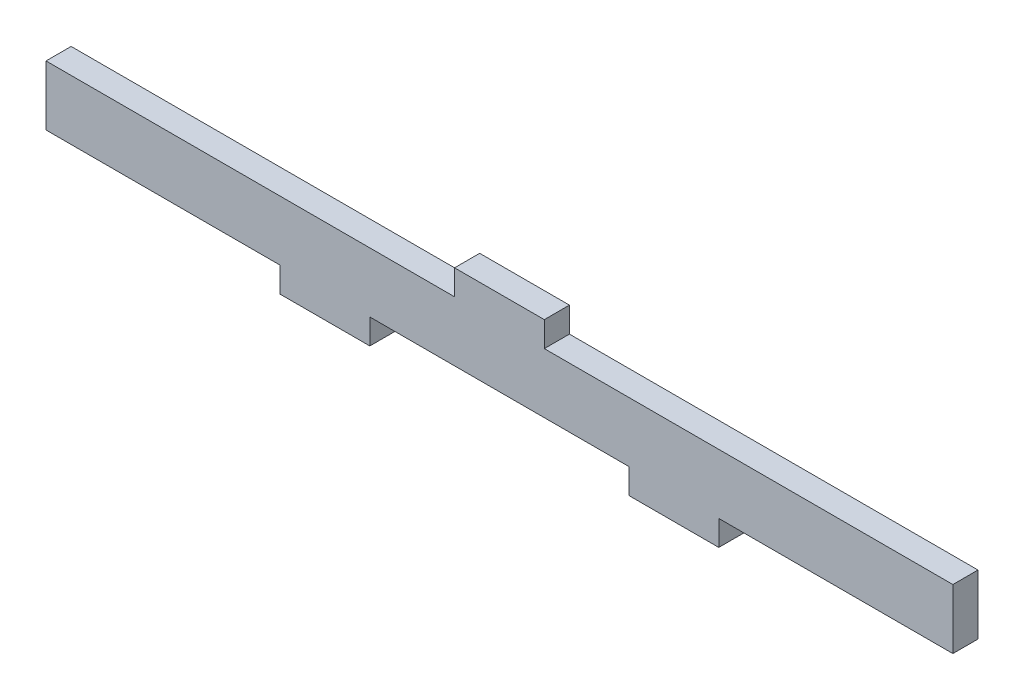
ISO-10303-21;
HEADER;
FILE_DESCRIPTION(('STEP AP214'),'2;1');
FILE_NAME('part.step','',(''),(''),'','','');
FILE_SCHEMA(('AUTOMOTIVE_DESIGN { 1 0 10303 214 1 1 1 1 }'));
ENDSEC;
DATA;
#1=APPLICATION_CONTEXT('core data for automotive mechanical design processes');
#2=APPLICATION_PROTOCOL_DEFINITION('international standard','automotive_design',2000,#1);
#3=PRODUCT_CONTEXT('',#1,'mechanical');
#4=PRODUCT('Part','Part','',(#3));
#5=PRODUCT_RELATED_PRODUCT_CATEGORY('part','',(#4));
#6=PRODUCT_DEFINITION_FORMATION('','',#4);
#7=PRODUCT_DEFINITION_CONTEXT('part definition',#1,'design');
#8=PRODUCT_DEFINITION('design','',#6,#7);
#9=PRODUCT_DEFINITION_SHAPE('','',#8);
#10=(LENGTH_UNIT() NAMED_UNIT(*) SI_UNIT(.MILLI.,.METRE.));
#11=(NAMED_UNIT(*) PLANE_ANGLE_UNIT() SI_UNIT($,.RADIAN.));
#12=(NAMED_UNIT(*) SI_UNIT($,.STERADIAN.) SOLID_ANGLE_UNIT());
#13=UNCERTAINTY_MEASURE_WITH_UNIT(LENGTH_MEASURE(1.E-05),#10,'distance_accuracy_value','');
#14=(GEOMETRIC_REPRESENTATION_CONTEXT(3) GLOBAL_UNCERTAINTY_ASSIGNED_CONTEXT((#13)) GLOBAL_UNIT_ASSIGNED_CONTEXT((#10,
#11,#12)) REPRESENTATION_CONTEXT('',''));
#15=CARTESIAN_POINT('',(0.,0.,0.));
#16=DIRECTION('',(0.,0.,1.));
#17=DIRECTION('',(1.,0.,0.));
#18=AXIS2_PLACEMENT_3D('',#15,#16,#17);
#19=CARTESIAN_POINT('',(0.,0.,5.334));
#20=DIRECTION('',(0.,1.,0.));
#21=DIRECTION('',(0.,0.,1.));
#22=AXIS2_PLACEMENT_3D('',#19,#20,#21);
#23=PLANE('',#22);
#24=DIRECTION('',(1.,0.,0.));
#25=VECTOR('',#24,1.);
#26=CARTESIAN_POINT('',(0.,0.,0.));
#27=LINE('',#26,#25);
#28=CARTESIAN_POINT('',(49.6993333333333,0.,0.));
#29=VERTEX_POINT('',#28);
#30=CARTESIAN_POINT('',(68.7493333333334,0.,0.));
#31=VERTEX_POINT('',#30);
#32=EDGE_CURVE('E169',#29,#31,#27,.T.);
#33=ORIENTED_EDGE('',*,*,#32,.T.);
#34=DIRECTION('',(0.,0.,1.));
#35=VECTOR('',#34,1.);
#36=CARTESIAN_POINT('',(68.7493333333334,0.,0.));
#37=LINE('',#36,#35);
#38=CARTESIAN_POINT('',(68.7493333333334,0.,5.334));
#39=VERTEX_POINT('',#38);
#40=EDGE_CURVE('E205',#31,#39,#37,.T.);
#41=ORIENTED_EDGE('',*,*,#40,.T.);
#42=DIRECTION('',(1.,0.,0.));
#43=VECTOR('',#42,1.);
#44=CARTESIAN_POINT('',(0.,0.,5.334));
#45=LINE('',#44,#43);
#46=CARTESIAN_POINT('',(49.6993333333333,0.,5.334));
#47=VERTEX_POINT('',#46);
#48=EDGE_CURVE('E183',#47,#39,#45,.T.);
#49=ORIENTED_EDGE('',*,*,#48,.F.);
#50=DIRECTION('',(0.,0.,1.));
#51=VECTOR('',#50,1.);
#52=CARTESIAN_POINT('',(49.6993333333333,0.,0.));
#53=LINE('',#52,#51);
#54=EDGE_CURVE('E186',#29,#47,#53,.T.);
#55=ORIENTED_EDGE('',*,*,#54,.F.);
#56=EDGE_LOOP('',(#33,#41,#49,#55));
#57=FACE_BOUND('',#56,.T.);
#58=ADVANCED_FACE('F32',(#57),#23,.F.);
#59=CARTESIAN_POINT('',(0.,0.,5.334));
#60=DIRECTION('',(1.,0.,0.));
#61=DIRECTION('',(0.,1.,0.));
#62=AXIS2_PLACEMENT_3D('',#59,#60,#61);
#63=PLANE('',#62);
#64=DIRECTION('',(0.,-1.,0.));
#65=VECTOR('',#64,1.);
#66=CARTESIAN_POINT('',(0.,0.,5.334));
#67=LINE('',#66,#65);
#68=CARTESIAN_POINT('',(0.,18.034,5.334));
#69=VERTEX_POINT('',#68);
#70=CARTESIAN_POINT('',(0.,5.334,5.334));
#71=VERTEX_POINT('',#70);
#72=EDGE_CURVE('E164',#69,#71,#67,.T.);
#73=ORIENTED_EDGE('',*,*,#72,.F.);
#74=DIRECTION('',(0.,0.,1.));
#75=VECTOR('',#74,1.);
#76=CARTESIAN_POINT('',(0.,18.034,0.));
#77=LINE('',#76,#75);
#78=CARTESIAN_POINT('',(0.,18.034,0.));
#79=VERTEX_POINT('',#78);
#80=EDGE_CURVE('E249',#79,#69,#77,.T.);
#81=ORIENTED_EDGE('',*,*,#80,.F.);
#82=DIRECTION('',(0.,-1.,0.));
#83=VECTOR('',#82,1.);
#84=CARTESIAN_POINT('',(0.,0.,0.));
#85=LINE('',#84,#83);
#86=CARTESIAN_POINT('',(0.,5.334,0.));
#87=VERTEX_POINT('',#86);
#88=EDGE_CURVE('E178',#79,#87,#85,.T.);
#89=ORIENTED_EDGE('',*,*,#88,.T.);
#90=DIRECTION('',(0.,0.,1.));
#91=VECTOR('',#90,1.);
#92=CARTESIAN_POINT('',(0.,5.334,0.));
#93=LINE('',#92,#91);
#94=EDGE_CURVE('E179',#87,#71,#93,.T.);
#95=ORIENTED_EDGE('',*,*,#94,.T.);
#96=EDGE_LOOP('',(#73,#81,#89,#95));
#97=FACE_BOUND('',#96,.T.);
#98=ADVANCED_FACE('F34',(#97),#63,.F.);
#99=CARTESIAN_POINT('',(123.782666666667,0.,0.));
#100=VERTEX_POINT('',#99);
#101=CARTESIAN_POINT('',(142.832666666667,0.,0.));
#102=VERTEX_POINT('',#101);
#103=EDGE_CURVE('E175',#100,#102,#27,.T.);
#104=ORIENTED_EDGE('',*,*,#103,.T.);
#105=DIRECTION('',(0.,0.,1.));
#106=VECTOR('',#105,1.);
#107=CARTESIAN_POINT('',(142.832666666667,0.,0.));
#108=LINE('',#107,#106);
#109=CARTESIAN_POINT('',(142.832666666667,0.,5.334));
#110=VERTEX_POINT('',#109);
#111=EDGE_CURVE('E223',#102,#110,#108,.T.);
#112=ORIENTED_EDGE('',*,*,#111,.T.);
#113=CARTESIAN_POINT('',(123.782666666667,0.,5.334));
#114=VERTEX_POINT('',#113);
#115=EDGE_CURVE('E166',#114,#110,#45,.T.);
#116=ORIENTED_EDGE('',*,*,#115,.F.);
#117=DIRECTION('',(0.,0.,1.));
#118=VECTOR('',#117,1.);
#119=CARTESIAN_POINT('',(123.782666666667,0.,0.));
#120=LINE('',#119,#118);
#121=EDGE_CURVE('E208',#100,#114,#120,.T.);
#122=ORIENTED_EDGE('',*,*,#121,.F.);
#123=EDGE_LOOP('',(#104,#112,#116,#122));
#124=FACE_BOUND('',#123,.T.);
#125=ADVANCED_FACE('F287',(#124),#23,.F.);
#126=CARTESIAN_POINT('',(192.532,0.,5.334));
#127=DIRECTION('',(-1.,0.,0.));
#128=DIRECTION('',(0.,-1.,0.));
#129=AXIS2_PLACEMENT_3D('',#126,#127,#128);
#130=PLANE('',#129);
#131=DIRECTION('',(0.,1.,0.));
#132=VECTOR('',#131,1.);
#133=CARTESIAN_POINT('',(192.532,0.,0.));
#134=LINE('',#133,#132);
#135=CARTESIAN_POINT('',(192.532,5.334,0.));
#136=VERTEX_POINT('',#135);
#137=CARTESIAN_POINT('',(192.532,18.034,0.));
#138=VERTEX_POINT('',#137);
#139=EDGE_CURVE('E165',#136,#138,#134,.T.);
#140=ORIENTED_EDGE('',*,*,#139,.T.);
#141=DIRECTION('',(0.,0.,1.));
#142=VECTOR('',#141,1.);
#143=CARTESIAN_POINT('',(192.532,18.034,0.));
#144=LINE('',#143,#142);
#145=CARTESIAN_POINT('',(192.532,18.034,5.334));
#146=VERTEX_POINT('',#145);
#147=EDGE_CURVE('E261',#138,#146,#144,.T.);
#148=ORIENTED_EDGE('',*,*,#147,.T.);
#149=DIRECTION('',(0.,1.,0.));
#150=VECTOR('',#149,1.);
#151=CARTESIAN_POINT('',(192.532,0.,5.334));
#152=LINE('',#151,#150);
#153=CARTESIAN_POINT('',(192.532,5.334,5.334));
#154=VERTEX_POINT('',#153);
#155=EDGE_CURVE('E41',#154,#146,#152,.T.);
#156=ORIENTED_EDGE('',*,*,#155,.F.);
#157=DIRECTION('',(0.,0.,1.));
#158=VECTOR('',#157,1.);
#159=CARTESIAN_POINT('',(192.532,5.334,0.));
#160=LINE('',#159,#158);
#161=EDGE_CURVE('E231',#136,#154,#160,.T.);
#162=ORIENTED_EDGE('',*,*,#161,.F.);
#163=EDGE_LOOP('',(#140,#148,#156,#162));
#164=FACE_BOUND('',#163,.T.);
#165=ADVANCED_FACE('F276',(#164),#130,.F.);
#166=CARTESIAN_POINT('',(0.,23.368,5.334));
#167=DIRECTION('',(0.,-1.,0.));
#168=DIRECTION('',(0.,0.,-1.));
#169=AXIS2_PLACEMENT_3D('',#166,#167,#168);
#170=PLANE('',#169);
#171=DIRECTION('',(-1.,0.,0.));
#172=VECTOR('',#171,1.);
#173=CARTESIAN_POINT('',(0.,23.368,5.334));
#174=LINE('',#173,#172);
#175=CARTESIAN_POINT('',(105.791,23.368,5.334));
#176=VERTEX_POINT('',#175);
#177=CARTESIAN_POINT('',(86.741,23.368,5.334));
#178=VERTEX_POINT('',#177);
#179=EDGE_CURVE('E11',#176,#178,#174,.T.);
#180=ORIENTED_EDGE('',*,*,#179,.F.);
#181=DIRECTION('',(0.,0.,1.));
#182=VECTOR('',#181,1.);
#183=CARTESIAN_POINT('',(105.791,23.368,0.));
#184=LINE('',#183,#182);
#185=CARTESIAN_POINT('',(105.791,23.368,0.));
#186=VERTEX_POINT('',#185);
#187=EDGE_CURVE('E150',#186,#176,#184,.T.);
#188=ORIENTED_EDGE('',*,*,#187,.F.);
#189=DIRECTION('',(-1.,0.,0.));
#190=VECTOR('',#189,1.);
#191=CARTESIAN_POINT('',(0.,23.368,0.));
#192=LINE('',#191,#190);
#193=CARTESIAN_POINT('',(86.741,23.368,0.));
#194=VERTEX_POINT('',#193);
#195=EDGE_CURVE('E36',#186,#194,#192,.T.);
#196=ORIENTED_EDGE('',*,*,#195,.T.);
#197=DIRECTION('',(0.,0.,1.));
#198=VECTOR('',#197,1.);
#199=CARTESIAN_POINT('',(86.741,23.368,0.));
#200=LINE('',#199,#198);
#201=EDGE_CURVE('E244',#194,#178,#200,.T.);
#202=ORIENTED_EDGE('',*,*,#201,.T.);
#203=EDGE_LOOP('',(#180,#188,#196,#202));
#204=FACE_BOUND('',#203,.T.);
#205=ADVANCED_FACE('F159',(#204),#170,.F.);
#206=CARTESIAN_POINT('',(0.,0.,5.334));
#207=DIRECTION('',(0.,0.,-1.));
#208=DIRECTION('',(-1.,0.,0.));
#209=AXIS2_PLACEMENT_3D('',#206,#207,#208);
#210=PLANE('',#209);
#211=ORIENTED_EDGE('',*,*,#155,.T.);
#212=DIRECTION('',(1.,0.,0.));
#213=VECTOR('',#212,1.);
#214=CARTESIAN_POINT('',(192.532,18.034,5.334));
#215=LINE('',#214,#213);
#216=CARTESIAN_POINT('',(105.791,18.034,5.334));
#217=VERTEX_POINT('',#216);
#218=EDGE_CURVE('E155',#217,#146,#215,.T.);
#219=ORIENTED_EDGE('',*,*,#218,.F.);
#220=DIRECTION('',(0.,-1.,0.));
#221=VECTOR('',#220,1.);
#222=CARTESIAN_POINT('',(105.791,23.368,5.334));
#223=LINE('',#222,#221);
#224=EDGE_CURVE('E267',#176,#217,#223,.T.);
#225=ORIENTED_EDGE('',*,*,#224,.F.);
#226=ORIENTED_EDGE('',*,*,#179,.T.);
#227=DIRECTION('',(0.,1.,0.));
#228=VECTOR('',#227,1.);
#229=CARTESIAN_POINT('',(86.741,23.368,5.334));
#230=LINE('',#229,#228);
#231=CARTESIAN_POINT('',(86.741,18.034,5.334));
#232=VERTEX_POINT('',#231);
#233=EDGE_CURVE('E254',#232,#178,#230,.T.);
#234=ORIENTED_EDGE('',*,*,#233,.F.);
#235=DIRECTION('',(1.,0.,0.));
#236=VECTOR('',#235,1.);
#237=CARTESIAN_POINT('',(0.,18.034,5.334));
#238=LINE('',#237,#236);
#239=EDGE_CURVE('E258',#69,#232,#238,.T.);
#240=ORIENTED_EDGE('',*,*,#239,.F.);
#241=ORIENTED_EDGE('',*,*,#72,.T.);
#242=DIRECTION('',(-1.,0.,0.));
#243=VECTOR('',#242,1.);
#244=CARTESIAN_POINT('',(0.,5.334,5.334));
#245=LINE('',#244,#243);
#246=CARTESIAN_POINT('',(49.6993333333333,5.334,5.334));
#247=VERTEX_POINT('',#246);
#248=EDGE_CURVE('E193',#247,#71,#245,.T.);
#249=ORIENTED_EDGE('',*,*,#248,.F.);
#250=DIRECTION('',(0.,1.,0.));
#251=VECTOR('',#250,1.);
#252=CARTESIAN_POINT('',(49.6993333333333,0.,5.334));
#253=LINE('',#252,#251);
#254=EDGE_CURVE('E197',#47,#247,#253,.T.);
#255=ORIENTED_EDGE('',*,*,#254,.F.);
#256=ORIENTED_EDGE('',*,*,#48,.T.);
#257=DIRECTION('',(0.,-1.,0.));
#258=VECTOR('',#257,1.);
#259=CARTESIAN_POINT('',(68.7493333333334,0.,5.334));
#260=LINE('',#259,#258);
#261=CARTESIAN_POINT('',(68.7493333333334,5.334,5.334));
#262=VERTEX_POINT('',#261);
#263=EDGE_CURVE('E221',#262,#39,#260,.T.);
#264=ORIENTED_EDGE('',*,*,#263,.F.);
#265=DIRECTION('',(-1.,0.,0.));
#266=VECTOR('',#265,1.);
#267=CARTESIAN_POINT('',(68.7493333333334,5.334,5.334));
#268=LINE('',#267,#266);
#269=CARTESIAN_POINT('',(123.782666666667,5.334,5.334));
#270=VERTEX_POINT('',#269);
#271=EDGE_CURVE('E214',#270,#262,#268,.T.);
#272=ORIENTED_EDGE('',*,*,#271,.F.);
#273=DIRECTION('',(0.,1.,0.));
#274=VECTOR('',#273,1.);
#275=CARTESIAN_POINT('',(123.782666666667,0.,5.334));
#276=LINE('',#275,#274);
#277=EDGE_CURVE('E218',#114,#270,#276,.T.);
#278=ORIENTED_EDGE('',*,*,#277,.F.);
#279=ORIENTED_EDGE('',*,*,#115,.T.);
#280=DIRECTION('',(0.,-1.,0.));
#281=VECTOR('',#280,1.);
#282=CARTESIAN_POINT('',(142.832666666667,0.,5.334));
#283=LINE('',#282,#281);
#284=CARTESIAN_POINT('',(142.832666666667,5.334,5.334));
#285=VERTEX_POINT('',#284);
#286=EDGE_CURVE('E238',#285,#110,#283,.T.);
#287=ORIENTED_EDGE('',*,*,#286,.F.);
#288=DIRECTION('',(-1.,0.,0.));
#289=VECTOR('',#288,1.);
#290=CARTESIAN_POINT('',(192.532,5.334,5.334));
#291=LINE('',#290,#289);
#292=EDGE_CURVE('E241',#154,#285,#291,.T.);
#293=ORIENTED_EDGE('',*,*,#292,.F.);
#294=EDGE_LOOP('',(#211,#219,#225,#226,#234,#240,#241,#249,#255,#256,#264,#272,#278,#279,#287,#293));
#295=FACE_BOUND('',#294,.T.);
#296=ADVANCED_FACE('F279',(#295),#210,.F.);
#297=CARTESIAN_POINT('',(0.,0.,0.));
#298=DIRECTION('',(0.,0.,-1.));
#299=DIRECTION('',(-1.,0.,0.));
#300=AXIS2_PLACEMENT_3D('',#297,#298,#299);
#301=PLANE('',#300);
#302=DIRECTION('',(1.,0.,0.));
#303=VECTOR('',#302,1.);
#304=CARTESIAN_POINT('',(192.532,18.034,0.));
#305=LINE('',#304,#303);
#306=CARTESIAN_POINT('',(105.791,18.034,0.));
#307=VERTEX_POINT('',#306);
#308=EDGE_CURVE('E49',#307,#138,#305,.T.);
#309=ORIENTED_EDGE('',*,*,#308,.T.);
#310=ORIENTED_EDGE('',*,*,#139,.F.);
#311=DIRECTION('',(-1.,0.,0.));
#312=VECTOR('',#311,1.);
#313=CARTESIAN_POINT('',(192.532,5.334,0.));
#314=LINE('',#313,#312);
#315=CARTESIAN_POINT('',(142.832666666667,5.334,0.));
#316=VERTEX_POINT('',#315);
#317=EDGE_CURVE('E240',#136,#316,#314,.T.);
#318=ORIENTED_EDGE('',*,*,#317,.T.);
#319=DIRECTION('',(0.,-1.,0.));
#320=VECTOR('',#319,1.);
#321=CARTESIAN_POINT('',(142.832666666667,0.,0.));
#322=LINE('',#321,#320);
#323=EDGE_CURVE('E234',#316,#102,#322,.T.);
#324=ORIENTED_EDGE('',*,*,#323,.T.);
#325=ORIENTED_EDGE('',*,*,#103,.F.);
#326=DIRECTION('',(0.,1.,0.));
#327=VECTOR('',#326,1.);
#328=CARTESIAN_POINT('',(123.782666666667,0.,0.));
#329=LINE('',#328,#327);
#330=CARTESIAN_POINT('',(123.782666666667,5.334,0.));
#331=VERTEX_POINT('',#330);
#332=EDGE_CURVE('E226',#100,#331,#329,.T.);
#333=ORIENTED_EDGE('',*,*,#332,.T.);
#334=DIRECTION('',(-1.,0.,0.));
#335=VECTOR('',#334,1.);
#336=CARTESIAN_POINT('',(68.7493333333334,5.334,0.));
#337=LINE('',#336,#335);
#338=CARTESIAN_POINT('',(68.7493333333334,5.334,0.));
#339=VERTEX_POINT('',#338);
#340=EDGE_CURVE('E209',#331,#339,#337,.T.);
#341=ORIENTED_EDGE('',*,*,#340,.T.);
#342=DIRECTION('',(0.,-1.,0.));
#343=VECTOR('',#342,1.);
#344=CARTESIAN_POINT('',(68.7493333333334,0.,0.));
#345=LINE('',#344,#343);
#346=EDGE_CURVE('E217',#339,#31,#345,.T.);
#347=ORIENTED_EDGE('',*,*,#346,.T.);
#348=ORIENTED_EDGE('',*,*,#32,.F.);
#349=DIRECTION('',(0.,1.,0.));
#350=VECTOR('',#349,1.);
#351=CARTESIAN_POINT('',(49.6993333333333,0.,0.));
#352=LINE('',#351,#350);
#353=CARTESIAN_POINT('',(49.6993333333333,5.334,0.));
#354=VERTEX_POINT('',#353);
#355=EDGE_CURVE('E196',#29,#354,#352,.T.);
#356=ORIENTED_EDGE('',*,*,#355,.T.);
#357=DIRECTION('',(-1.,0.,0.));
#358=VECTOR('',#357,1.);
#359=CARTESIAN_POINT('',(0.,5.334,0.));
#360=LINE('',#359,#358);
#361=EDGE_CURVE('E189',#354,#87,#360,.T.);
#362=ORIENTED_EDGE('',*,*,#361,.T.);
#363=ORIENTED_EDGE('',*,*,#88,.F.);
#364=DIRECTION('',(1.,0.,0.));
#365=VECTOR('',#364,1.);
#366=CARTESIAN_POINT('',(0.,18.034,0.));
#367=LINE('',#366,#365);
#368=CARTESIAN_POINT('',(86.741,18.034,0.));
#369=VERTEX_POINT('',#368);
#370=EDGE_CURVE('E257',#79,#369,#367,.T.);
#371=ORIENTED_EDGE('',*,*,#370,.T.);
#372=DIRECTION('',(0.,1.,0.));
#373=VECTOR('',#372,1.);
#374=CARTESIAN_POINT('',(86.741,23.368,0.));
#375=LINE('',#374,#373);
#376=EDGE_CURVE('E57',#369,#194,#375,.T.);
#377=ORIENTED_EDGE('',*,*,#376,.T.);
#378=ORIENTED_EDGE('',*,*,#195,.F.);
#379=DIRECTION('',(0.,-1.,0.));
#380=VECTOR('',#379,1.);
#381=CARTESIAN_POINT('',(105.791,23.368,0.));
#382=LINE('',#381,#380);
#383=EDGE_CURVE('E146',#186,#307,#382,.T.);
#384=ORIENTED_EDGE('',*,*,#383,.T.);
#385=EDGE_LOOP('',(#309,#310,#318,#324,#325,#333,#341,#347,#348,#356,#362,#363,#371,#377,#378,#384));
#386=FACE_BOUND('',#385,.T.);
#387=ADVANCED_FACE('F162',(#386),#301,.T.);
#388=CARTESIAN_POINT('',(0.,5.334,0.));
#389=DIRECTION('',(0.,1.,0.));
#390=DIRECTION('',(0.,0.,1.));
#391=AXIS2_PLACEMENT_3D('',#388,#389,#390);
#392=PLANE('',#391);
#393=ORIENTED_EDGE('',*,*,#248,.T.);
#394=ORIENTED_EDGE('',*,*,#94,.F.);
#395=ORIENTED_EDGE('',*,*,#361,.F.);
#396=DIRECTION('',(0.,0.,1.));
#397=VECTOR('',#396,1.);
#398=CARTESIAN_POINT('',(49.6993333333333,5.334,0.));
#399=LINE('',#398,#397);
#400=EDGE_CURVE('E188',#354,#247,#399,.T.);
#401=ORIENTED_EDGE('',*,*,#400,.T.);
#402=EDGE_LOOP('',(#393,#394,#395,#401));
#403=FACE_BOUND('',#402,.T.);
#404=ADVANCED_FACE('F312',(#403),#392,.F.);
#405=CARTESIAN_POINT('',(49.6993333333333,0.,0.));
#406=DIRECTION('',(1.,0.,0.));
#407=DIRECTION('',(0.,0.,-1.));
#408=AXIS2_PLACEMENT_3D('',#405,#406,#407);
#409=PLANE('',#408);
#410=ORIENTED_EDGE('',*,*,#254,.T.);
#411=ORIENTED_EDGE('',*,*,#400,.F.);
#412=ORIENTED_EDGE('',*,*,#355,.F.);
#413=ORIENTED_EDGE('',*,*,#54,.T.);
#414=EDGE_LOOP('',(#410,#411,#412,#413));
#415=FACE_BOUND('',#414,.T.);
#416=ADVANCED_FACE('F305',(#415),#409,.F.);
#417=CARTESIAN_POINT('',(68.7493333333334,0.,0.));
#418=DIRECTION('',(-1.,0.,0.));
#419=DIRECTION('',(0.,0.,1.));
#420=AXIS2_PLACEMENT_3D('',#417,#418,#419);
#421=PLANE('',#420);
#422=ORIENTED_EDGE('',*,*,#263,.T.);
#423=ORIENTED_EDGE('',*,*,#40,.F.);
#424=ORIENTED_EDGE('',*,*,#346,.F.);
#425=DIRECTION('',(0.,0.,1.));
#426=VECTOR('',#425,1.);
#427=CARTESIAN_POINT('',(68.7493333333334,5.334,0.));
#428=LINE('',#427,#426);
#429=EDGE_CURVE('E200',#339,#262,#428,.T.);
#430=ORIENTED_EDGE('',*,*,#429,.T.);
#431=EDGE_LOOP('',(#422,#423,#424,#430));
#432=FACE_BOUND('',#431,.T.);
#433=ADVANCED_FACE('F298',(#432),#421,.F.);
#434=CARTESIAN_POINT('',(68.7493333333334,5.334,0.));
#435=DIRECTION('',(0.,1.,0.));
#436=DIRECTION('',(0.,0.,1.));
#437=AXIS2_PLACEMENT_3D('',#434,#435,#436);
#438=PLANE('',#437);
#439=ORIENTED_EDGE('',*,*,#271,.T.);
#440=ORIENTED_EDGE('',*,*,#429,.F.);
#441=ORIENTED_EDGE('',*,*,#340,.F.);
#442=DIRECTION('',(0.,0.,1.));
#443=VECTOR('',#442,1.);
#444=CARTESIAN_POINT('',(123.782666666667,5.334,0.));
#445=LINE('',#444,#443);
#446=EDGE_CURVE('E211',#331,#270,#445,.T.);
#447=ORIENTED_EDGE('',*,*,#446,.T.);
#448=EDGE_LOOP('',(#439,#440,#441,#447));
#449=FACE_BOUND('',#448,.T.);
#450=ADVANCED_FACE('F294',(#449),#438,.F.);
#451=CARTESIAN_POINT('',(123.782666666667,0.,0.));
#452=DIRECTION('',(1.,0.,0.));
#453=DIRECTION('',(0.,0.,-1.));
#454=AXIS2_PLACEMENT_3D('',#451,#452,#453);
#455=PLANE('',#454);
#456=ORIENTED_EDGE('',*,*,#277,.T.);
#457=ORIENTED_EDGE('',*,*,#446,.F.);
#458=ORIENTED_EDGE('',*,*,#332,.F.);
#459=ORIENTED_EDGE('',*,*,#121,.T.);
#460=EDGE_LOOP('',(#456,#457,#458,#459));
#461=FACE_BOUND('',#460,.T.);
#462=ADVANCED_FACE('F291',(#461),#455,.F.);
#463=CARTESIAN_POINT('',(142.832666666667,0.,0.));
#464=DIRECTION('',(-1.,0.,0.));
#465=DIRECTION('',(0.,0.,1.));
#466=AXIS2_PLACEMENT_3D('',#463,#464,#465);
#467=PLANE('',#466);
#468=ORIENTED_EDGE('',*,*,#286,.T.);
#469=ORIENTED_EDGE('',*,*,#111,.F.);
#470=ORIENTED_EDGE('',*,*,#323,.F.);
#471=DIRECTION('',(0.,0.,1.));
#472=VECTOR('',#471,1.);
#473=CARTESIAN_POINT('',(142.832666666667,5.334,0.));
#474=LINE('',#473,#472);
#475=EDGE_CURVE('E233',#316,#285,#474,.T.);
#476=ORIENTED_EDGE('',*,*,#475,.T.);
#477=EDGE_LOOP('',(#468,#469,#470,#476));
#478=FACE_BOUND('',#477,.T.);
#479=ADVANCED_FACE('F285',(#478),#467,.F.);
#480=CARTESIAN_POINT('',(192.532,5.334,0.));
#481=DIRECTION('',(0.,1.,0.));
#482=DIRECTION('',(0.,0.,1.));
#483=AXIS2_PLACEMENT_3D('',#480,#481,#482);
#484=PLANE('',#483);
#485=ORIENTED_EDGE('',*,*,#292,.T.);
#486=ORIENTED_EDGE('',*,*,#475,.F.);
#487=ORIENTED_EDGE('',*,*,#317,.F.);
#488=ORIENTED_EDGE('',*,*,#161,.T.);
#489=EDGE_LOOP('',(#485,#486,#487,#488));
#490=FACE_BOUND('',#489,.T.);
#491=ADVANCED_FACE('F273',(#490),#484,.F.);
#492=CARTESIAN_POINT('',(86.741,23.368,0.));
#493=DIRECTION('',(1.,0.,0.));
#494=DIRECTION('',(0.,0.,-1.));
#495=AXIS2_PLACEMENT_3D('',#492,#493,#494);
#496=PLANE('',#495);
#497=ORIENTED_EDGE('',*,*,#233,.T.);
#498=ORIENTED_EDGE('',*,*,#201,.F.);
#499=ORIENTED_EDGE('',*,*,#376,.F.);
#500=DIRECTION('',(0.,0.,1.));
#501=VECTOR('',#500,1.);
#502=CARTESIAN_POINT('',(86.741,18.034,0.));
#503=LINE('',#502,#501);
#504=EDGE_CURVE('E251',#369,#232,#503,.T.);
#505=ORIENTED_EDGE('',*,*,#504,.T.);
#506=EDGE_LOOP('',(#497,#498,#499,#505));
#507=FACE_BOUND('',#506,.T.);
#508=ADVANCED_FACE('F319',(#507),#496,.F.);
#509=CARTESIAN_POINT('',(0.,18.034,0.));
#510=DIRECTION('',(0.,-1.,0.));
#511=DIRECTION('',(0.,0.,-1.));
#512=AXIS2_PLACEMENT_3D('',#509,#510,#511);
#513=PLANE('',#512);
#514=ORIENTED_EDGE('',*,*,#239,.T.);
#515=ORIENTED_EDGE('',*,*,#504,.F.);
#516=ORIENTED_EDGE('',*,*,#370,.F.);
#517=ORIENTED_EDGE('',*,*,#80,.T.);
#518=EDGE_LOOP('',(#514,#515,#516,#517));
#519=FACE_BOUND('',#518,.T.);
#520=ADVANCED_FACE('F317',(#519),#513,.F.);
#521=CARTESIAN_POINT('',(192.532,18.034,0.));
#522=DIRECTION('',(0.,-1.,0.));
#523=DIRECTION('',(0.,0.,-1.));
#524=AXIS2_PLACEMENT_3D('',#521,#522,#523);
#525=PLANE('',#524);
#526=ORIENTED_EDGE('',*,*,#218,.T.);
#527=ORIENTED_EDGE('',*,*,#147,.F.);
#528=ORIENTED_EDGE('',*,*,#308,.F.);
#529=DIRECTION('',(0.,0.,1.));
#530=VECTOR('',#529,1.);
#531=CARTESIAN_POINT('',(105.791,18.034,0.));
#532=LINE('',#531,#530);
#533=EDGE_CURVE('E152',#307,#217,#532,.T.);
#534=ORIENTED_EDGE('',*,*,#533,.T.);
#535=EDGE_LOOP('',(#526,#527,#528,#534));
#536=FACE_BOUND('',#535,.T.);
#537=ADVANCED_FACE('F326',(#536),#525,.F.);
#538=CARTESIAN_POINT('',(105.791,23.368,0.));
#539=DIRECTION('',(-1.,0.,0.));
#540=DIRECTION('',(0.,0.,1.));
#541=AXIS2_PLACEMENT_3D('',#538,#539,#540);
#542=PLANE('',#541);
#543=ORIENTED_EDGE('',*,*,#224,.T.);
#544=ORIENTED_EDGE('',*,*,#533,.F.);
#545=ORIENTED_EDGE('',*,*,#383,.F.);
#546=ORIENTED_EDGE('',*,*,#187,.T.);
#547=EDGE_LOOP('',(#543,#544,#545,#546));
#548=FACE_BOUND('',#547,.T.);
#549=ADVANCED_FACE('F149',(#548),#542,.F.);
#550=CLOSED_SHELL('',(#58,#98,#125,#165,#205,#296,#387,#404,#416,#433,#450,#462,#479,#491,#508,
#520,#537,#549));
#551=MANIFOLD_SOLID_BREP('B2',#550);
#552=ADVANCED_BREP_SHAPE_REPRESENTATION('',(#18,#551),#14);
#553=SHAPE_DEFINITION_REPRESENTATION(#9,#552);
ENDSEC;
END-ISO-10303-21;
